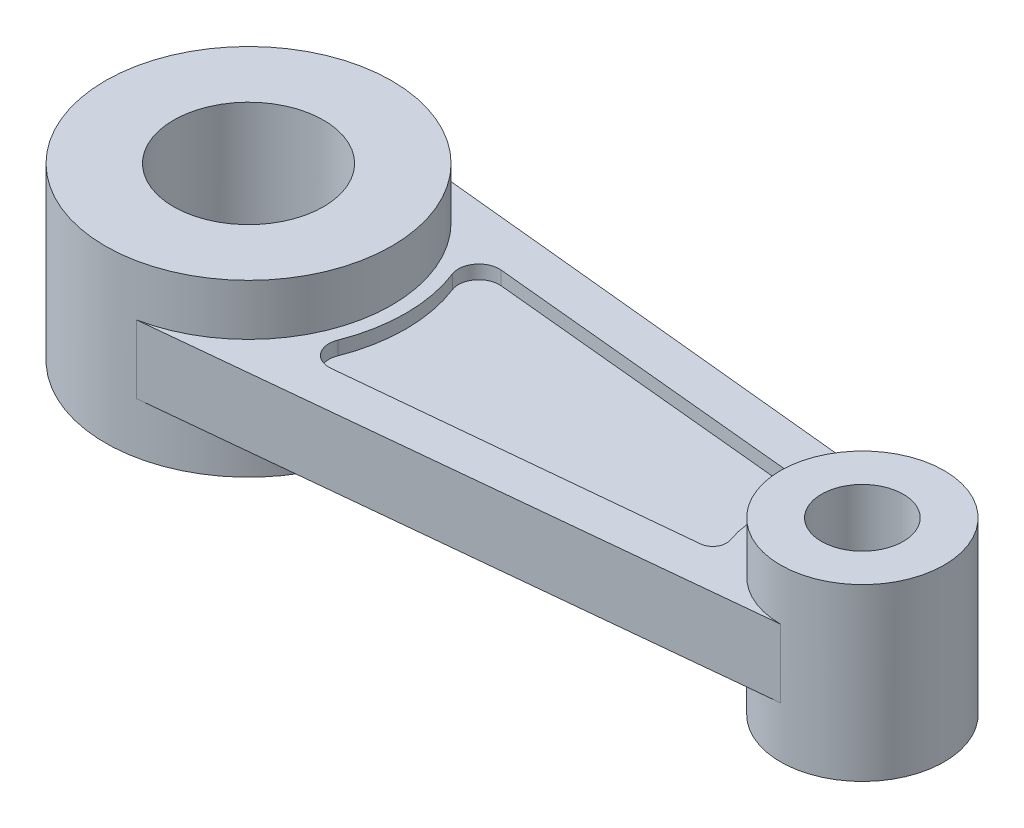
ISO-10303-21;
HEADER;
FILE_DESCRIPTION(('STEP AP214'),'2;1');
FILE_NAME('part.step','',(''),(''),'','','');
FILE_SCHEMA(('AUTOMOTIVE_DESIGN { 1 0 10303 214 1 1 1 1 }'));
ENDSEC;
DATA;
#1=APPLICATION_CONTEXT('core data for automotive mechanical design processes');
#2=APPLICATION_PROTOCOL_DEFINITION('international standard','automotive_design',2000,#1);
#3=PRODUCT_CONTEXT('',#1,'mechanical');
#4=PRODUCT('Part','Part','',(#3));
#5=PRODUCT_RELATED_PRODUCT_CATEGORY('part','',(#4));
#6=PRODUCT_DEFINITION_FORMATION('','',#4);
#7=PRODUCT_DEFINITION_CONTEXT('part definition',#1,'design');
#8=PRODUCT_DEFINITION('design','',#6,#7);
#9=PRODUCT_DEFINITION_SHAPE('','',#8);
#10=(LENGTH_UNIT() NAMED_UNIT(*) SI_UNIT(.MILLI.,.METRE.));
#11=(NAMED_UNIT(*) PLANE_ANGLE_UNIT() SI_UNIT($,.RADIAN.));
#12=(NAMED_UNIT(*) SI_UNIT($,.STERADIAN.) SOLID_ANGLE_UNIT());
#13=UNCERTAINTY_MEASURE_WITH_UNIT(LENGTH_MEASURE(1.E-05),#10,'distance_accuracy_value','');
#14=(GEOMETRIC_REPRESENTATION_CONTEXT(3) GLOBAL_UNCERTAINTY_ASSIGNED_CONTEXT((#13)) GLOBAL_UNIT_ASSIGNED_CONTEXT((#10,
#11,#12)) REPRESENTATION_CONTEXT('',''));
#15=CARTESIAN_POINT('',(0.,0.,0.));
#16=DIRECTION('',(0.,0.,1.));
#17=DIRECTION('',(1.,0.,0.));
#18=AXIS2_PLACEMENT_3D('',#15,#16,#17);
#19=CARTESIAN_POINT('',(0.,5.,0.));
#20=DIRECTION('',(0.,-1.,0.));
#21=DIRECTION('',(0.,0.,-1.));
#22=AXIS2_PLACEMENT_3D('',#19,#20,#21);
#23=PLANE('',#22);
#24=CARTESIAN_POINT('',(90.,5.,0.));
#25=DIRECTION('',(0.,-1.,0.));
#26=DIRECTION('',(0.,0.,-1.));
#27=AXIS2_PLACEMENT_3D('',#24,#25,#26);
#28=CIRCLE('',#27,12.);
#29=CARTESIAN_POINT('',(90.,5.,-12.));
#30=VERTEX_POINT('',#29);
#31=CARTESIAN_POINT('',(90.,5.,12.));
#32=VERTEX_POINT('',#31);
#33=EDGE_CURVE('E11',#30,#32,#28,.F.);
#34=ORIENTED_EDGE('',*,*,#33,.F.);
#35=DIRECTION('',(0.995037190209989,0.,0.0995037190209989));
#36=VECTOR('',#35,1.);
#37=CARTESIAN_POINT('',(0.,5.,-21.));
#38=LINE('',#37,#36);
#39=CARTESIAN_POINT('',(4.15841584158416,5.,-20.5841584158416));
#40=VERTEX_POINT('',#39);
#41=EDGE_CURVE('E397',#40,#30,#38,.T.);
#42=ORIENTED_EDGE('',*,*,#41,.F.);
#43=CARTESIAN_POINT('',(0.,5.,0.));
#44=DIRECTION('',(0.,-1.,0.));
#45=DIRECTION('',(0.,0.,-1.));
#46=AXIS2_PLACEMENT_3D('',#43,#44,#45);
#47=CIRCLE('',#46,21.);
#48=CARTESIAN_POINT('',(4.1584158415842,5.,20.5841584158416));
#49=VERTEX_POINT('',#48);
#50=EDGE_CURVE('E49',#49,#40,#47,.F.);
#51=ORIENTED_EDGE('',*,*,#50,.F.);
#52=DIRECTION('',(-0.995037190209989,0.,0.0995037190209989));
#53=VECTOR('',#52,1.);
#54=CARTESIAN_POINT('',(90.,5.,12.));
#55=LINE('',#54,#53);
#56=EDGE_CURVE('E393',#32,#49,#55,.T.);
#57=ORIENTED_EDGE('',*,*,#56,.F.);
#58=EDGE_LOOP('',(#34,#42,#51,#57));
#59=FACE_BOUND('',#58,.T.);
#60=CARTESIAN_POINT('',(24.2724452301592,5.,9.49146466859802));
#61=DIRECTION('',(0.,-1.,0.));
#62=DIRECTION('',(0.,0.,-1.));
#63=AXIS2_PLACEMENT_3D('',#60,#61,#62);
#64=CIRCLE('',#63,3.);
#65=CARTESIAN_POINT('',(24.5626925527096,5.,12.477391072874));
#66=VERTEX_POINT('',#65);
#67=CARTESIAN_POINT('',(21.4784650692004,5.,8.39891038611666));
#68=VERTEX_POINT('',#67);
#69=EDGE_CURVE('E65',#66,#68,#64,.T.);
#70=ORIENTED_EDGE('',*,*,#69,.T.);
#71=CARTESIAN_POINT('',(0.,5.,0.));
#72=DIRECTION('',(0.,1.,0.));
#73=DIRECTION('',(0.,0.,1.));
#74=AXIS2_PLACEMENT_3D('',#71,#72,#73);
#75=CIRCLE('',#74,23.0622236005741);
#76=CARTESIAN_POINT('',(21.4784650692004,5.,-8.39891038611666));
#77=VERTEX_POINT('',#76);
#78=EDGE_CURVE('E303',#68,#77,#75,.T.);
#79=ORIENTED_EDGE('',*,*,#78,.T.);
#80=CARTESIAN_POINT('',(24.2724452301592,5.,-9.49146466859802));
#81=DIRECTION('',(0.,-1.,0.));
#82=DIRECTION('',(0.,0.,-1.));
#83=AXIS2_PLACEMENT_3D('',#80,#81,#82);
#84=CIRCLE('',#83,3.);
#85=CARTESIAN_POINT('',(24.5626925527096,5.,-12.477391072874));
#86=VERTEX_POINT('',#85);
#87=EDGE_CURVE('E307',#77,#86,#84,.T.);
#88=ORIENTED_EDGE('',*,*,#87,.T.);
#89=DIRECTION('',(0.995308801425318,0.,0.0967491075167938));
#90=VECTOR('',#89,1.);
#91=CARTESIAN_POINT('',(24.5626925527096,5.,-12.477391072874));
#92=LINE('',#91,#90);
#93=CARTESIAN_POINT('',(73.9432407691823,5.,-7.67734915443405));
#94=VERTEX_POINT('',#93);
#95=EDGE_CURVE('E311',#86,#94,#92,.T.);
#96=ORIENTED_EDGE('',*,*,#95,.T.);
#97=CARTESIAN_POINT('',(73.7497425541487,5.,-5.68673155158341));
#98=DIRECTION('',(0.,1.,0.));
#99=DIRECTION('',(0.,0.,1.));
#100=AXIS2_PLACEMENT_3D('',#97,#98,#99);
#101=CIRCLE('',#100,2.);
#102=CARTESIAN_POINT('',(75.637490362848,5.,-5.02611955445448));
#103=VERTEX_POINT('',#102);
#104=EDGE_CURVE('E315',#103,#94,#101,.T.);
#105=ORIENTED_EDGE('',*,*,#104,.F.);
#106=CARTESIAN_POINT('',(90.,5.,0.));
#107=DIRECTION('',(0.,1.,0.));
#108=DIRECTION('',(0.,0.,1.));
#109=AXIS2_PLACEMENT_3D('',#106,#107,#108);
#110=CIRCLE('',#109,15.2165554858172);
#111=CARTESIAN_POINT('',(75.637490362848,5.,5.02611955445448));
#112=VERTEX_POINT('',#111);
#113=EDGE_CURVE('E319',#103,#112,#110,.T.);
#114=ORIENTED_EDGE('',*,*,#113,.T.);
#115=CARTESIAN_POINT('',(73.7497425541487,5.,5.68673155158342));
#116=DIRECTION('',(0.,1.,0.));
#117=DIRECTION('',(0.,0.,1.));
#118=AXIS2_PLACEMENT_3D('',#115,#116,#117);
#119=CIRCLE('',#118,2.);
#120=CARTESIAN_POINT('',(73.9432407691823,5.,7.67734915443405));
#121=VERTEX_POINT('',#120);
#122=EDGE_CURVE('E323',#121,#112,#119,.T.);
#123=ORIENTED_EDGE('',*,*,#122,.F.);
#124=DIRECTION('',(0.995308801425318,0.,-0.0967491075167937));
#125=VECTOR('',#124,1.);
#126=CARTESIAN_POINT('',(24.5626925527096,5.,12.477391072874));
#127=LINE('',#126,#125);
#128=EDGE_CURVE('E276',#66,#121,#127,.T.);
#129=ORIENTED_EDGE('',*,*,#128,.F.);
#130=EDGE_LOOP('',(#70,#79,#88,#96,#105,#114,#123,#129));
#131=FACE_BOUND('',#130,.T.);
#132=ADVANCED_FACE('F39',(#59,#131),#23,.F.);
#133=CARTESIAN_POINT('',(90.,5.,12.));
#134=DIRECTION('',(0.0995037190209989,0.,0.995037190209989));
#135=DIRECTION('',(0.995037190209989,0.,-0.0995037190209989));
#136=AXIS2_PLACEMENT_3D('',#133,#134,#135);
#137=PLANE('',#136);
#138=DIRECTION('',(0.,-1.,0.));
#139=VECTOR('',#138,1.);
#140=CARTESIAN_POINT('',(4.1584158415841,12.5,20.5841584158416));
#141=LINE('',#140,#139);
#142=CARTESIAN_POINT('',(4.1584158415841,-5.,20.5841584158416));
#143=VERTEX_POINT('',#142);
#144=EDGE_CURVE('E389',#49,#143,#141,.T.);
#145=ORIENTED_EDGE('',*,*,#144,.T.);
#146=DIRECTION('',(-0.995037190209989,0.,0.0995037190209989));
#147=VECTOR('',#146,1.);
#148=CARTESIAN_POINT('',(90.,-5.,12.));
#149=LINE('',#148,#147);
#150=CARTESIAN_POINT('',(90.,-5.,12.));
#151=VERTEX_POINT('',#150);
#152=EDGE_CURVE('E392',#151,#143,#149,.T.);
#153=ORIENTED_EDGE('',*,*,#152,.F.);
#154=DIRECTION('',(0.,-1.,0.));
#155=VECTOR('',#154,1.);
#156=CARTESIAN_POINT('',(90.,5.,12.));
#157=LINE('',#156,#155);
#158=EDGE_CURVE('E411',#32,#151,#157,.T.);
#159=ORIENTED_EDGE('',*,*,#158,.F.);
#160=ORIENTED_EDGE('',*,*,#56,.T.);
#161=EDGE_LOOP('',(#145,#153,#159,#160));
#162=FACE_BOUND('',#161,.T.);
#163=ADVANCED_FACE('F41',(#162),#137,.T.);
#164=CARTESIAN_POINT('',(0.,5.,-21.));
#165=DIRECTION('',(0.0995037190209989,0.,-0.995037190209989));
#166=DIRECTION('',(-0.995037190209989,0.,-0.0995037190209989));
#167=AXIS2_PLACEMENT_3D('',#164,#165,#166);
#168=PLANE('',#167);
#169=DIRECTION('',(0.995037190209989,0.,0.0995037190209989));
#170=VECTOR('',#169,1.);
#171=CARTESIAN_POINT('',(0.,-5.,-21.));
#172=LINE('',#171,#170);
#173=CARTESIAN_POINT('',(4.15841584158416,-5.,-20.5841584158416));
#174=VERTEX_POINT('',#173);
#175=CARTESIAN_POINT('',(90.,-5.,-12.));
#176=VERTEX_POINT('',#175);
#177=EDGE_CURVE('E398',#174,#176,#172,.T.);
#178=ORIENTED_EDGE('',*,*,#177,.F.);
#179=DIRECTION('',(0.,-1.,0.));
#180=VECTOR('',#179,1.);
#181=CARTESIAN_POINT('',(4.1584158415841,12.5,-20.5841584158416));
#182=LINE('',#181,#180);
#183=EDGE_CURVE('E386',#174,#40,#182,.F.);
#184=ORIENTED_EDGE('',*,*,#183,.T.);
#185=ORIENTED_EDGE('',*,*,#41,.T.);
#186=DIRECTION('',(0.,-1.,0.));
#187=VECTOR('',#186,1.);
#188=CARTESIAN_POINT('',(90.,5.,-12.));
#189=LINE('',#188,#187);
#190=EDGE_CURVE('E402',#30,#176,#189,.T.);
#191=ORIENTED_EDGE('',*,*,#190,.T.);
#192=EDGE_LOOP('',(#178,#184,#185,#191));
#193=FACE_BOUND('',#192,.T.);
#194=ADVANCED_FACE('F456',(#193),#168,.T.);
#195=CARTESIAN_POINT('',(0.,-5.,0.));
#196=DIRECTION('',(0.,-1.,0.));
#197=DIRECTION('',(0.,0.,-1.));
#198=AXIS2_PLACEMENT_3D('',#195,#196,#197);
#199=PLANE('',#198);
#200=CARTESIAN_POINT('',(75.4625246039867,-5.,6.12689569126327));
#201=DIRECTION('',(0.,-1.,0.));
#202=DIRECTION('',(0.,0.,-1.));
#203=AXIS2_PLACEMENT_3D('',#200,#201,#202);
#204=CIRCLE('',#203,2.);
#205=CARTESIAN_POINT('',(77.3055298459093,-5.,5.35015141014773));
#206=VERTEX_POINT('',#205);
#207=CARTESIAN_POINT('',(75.6538519051062,-5.,8.11772312322373));
#208=VERTEX_POINT('',#207);
#209=EDGE_CURVE('E57',#206,#208,#204,.T.);
#210=ORIENTED_EDGE('',*,*,#209,.F.);
#211=CARTESIAN_POINT('',(90.,-5.,0.));
#212=DIRECTION('',(0.,-1.,0.));
#213=DIRECTION('',(0.,0.,-1.));
#214=AXIS2_PLACEMENT_3D('',#211,#212,#213);
#215=CIRCLE('',#214,13.775837274177);
#216=CARTESIAN_POINT('',(77.3055298459093,-5.,-5.35015141014772));
#217=VERTEX_POINT('',#216);
#218=EDGE_CURVE('E203',#206,#217,#215,.T.);
#219=ORIENTED_EDGE('',*,*,#218,.T.);
#220=CARTESIAN_POINT('',(75.4625246039867,-5.,-6.12689569126327));
#221=DIRECTION('',(0.,-1.,0.));
#222=DIRECTION('',(0.,0.,-1.));
#223=AXIS2_PLACEMENT_3D('',#220,#221,#222);
#224=CIRCLE('',#223,2.);
#225=CARTESIAN_POINT('',(75.6538519051063,-5.,-8.11772312322374));
#226=VERTEX_POINT('',#225);
#227=EDGE_CURVE('E207',#226,#217,#224,.T.);
#228=ORIENTED_EDGE('',*,*,#227,.F.);
#229=DIRECTION('',(0.995413715980232,0.,0.0956636505597921));
#230=VECTOR('',#229,1.);
#231=CARTESIAN_POINT('',(25.3522196932445,-5.,-12.9519319443912));
#232=LINE('',#231,#230);
#233=CARTESIAN_POINT('',(25.3522196932445,-5.,-12.9519319443912));
#234=VERTEX_POINT('',#233);
#235=EDGE_CURVE('E244',#234,#226,#232,.T.);
#236=ORIENTED_EDGE('',*,*,#235,.F.);
#237=CARTESIAN_POINT('',(25.0652287415651,-5.,-9.96569079645051));
#238=DIRECTION('',(0.,1.,0.));
#239=DIRECTION('',(0.,0.,1.));
#240=AXIS2_PLACEMENT_3D('',#237,#238,#239);
#241=CIRCLE('',#240,3.);
#242=CARTESIAN_POINT('',(22.277488229895,-5.,-8.85731232336785));
#243=VERTEX_POINT('',#242);
#244=EDGE_CURVE('E240',#234,#243,#241,.T.);
#245=ORIENTED_EDGE('',*,*,#244,.T.);
#246=CARTESIAN_POINT('',(0.,-5.,0.));
#247=DIRECTION('',(0.,-1.,0.));
#248=DIRECTION('',(0.,0.,-1.));
#249=AXIS2_PLACEMENT_3D('',#246,#247,#248);
#250=CIRCLE('',#249,23.9737035817746);
#251=CARTESIAN_POINT('',(22.277488229895,-5.,8.85731232336785));
#252=VERTEX_POINT('',#251);
#253=EDGE_CURVE('E236',#243,#252,#250,.T.);
#254=ORIENTED_EDGE('',*,*,#253,.T.);
#255=CARTESIAN_POINT('',(25.0652287415651,-5.,9.96569079645051));
#256=DIRECTION('',(0.,1.,0.));
#257=DIRECTION('',(0.,0.,1.));
#258=AXIS2_PLACEMENT_3D('',#255,#256,#257);
#259=CIRCLE('',#258,3.);
#260=CARTESIAN_POINT('',(25.3522196932445,-5.,12.9519319443912));
#261=VERTEX_POINT('',#260);
#262=EDGE_CURVE('E232',#252,#261,#259,.T.);
#263=ORIENTED_EDGE('',*,*,#262,.T.);
#264=DIRECTION('',(-0.995413715980232,0.,0.0956636505597921));
#265=VECTOR('',#264,1.);
#266=CARTESIAN_POINT('',(75.6538519051063,-5.,8.11772312322374));
#267=LINE('',#266,#265);
#268=EDGE_CURVE('E229',#208,#261,#267,.T.);
#269=ORIENTED_EDGE('',*,*,#268,.F.);
#270=EDGE_LOOP('',(#210,#219,#228,#236,#245,#254,#263,#269));
#271=FACE_BOUND('',#270,.T.);
#272=ORIENTED_EDGE('',*,*,#177,.T.);
#273=CARTESIAN_POINT('',(90.,-5.,0.));
#274=DIRECTION('',(0.,-1.,0.));
#275=DIRECTION('',(0.,0.,-1.));
#276=AXIS2_PLACEMENT_3D('',#273,#274,#275);
#277=CIRCLE('',#276,12.);
#278=EDGE_CURVE('E366',#176,#151,#277,.F.);
#279=ORIENTED_EDGE('',*,*,#278,.T.);
#280=ORIENTED_EDGE('',*,*,#152,.T.);
#281=CARTESIAN_POINT('',(0.,-5.,0.));
#282=DIRECTION('',(0.,-1.,0.));
#283=DIRECTION('',(0.,0.,-1.));
#284=AXIS2_PLACEMENT_3D('',#281,#282,#283);
#285=CIRCLE('',#284,21.);
#286=EDGE_CURVE('E374',#143,#174,#285,.F.);
#287=ORIENTED_EDGE('',*,*,#286,.T.);
#288=EDGE_LOOP('',(#272,#279,#280,#287));
#289=FACE_BOUND('',#288,.T.);
#290=ADVANCED_FACE('F435',(#271,#289),#199,.T.);
#291=CARTESIAN_POINT('',(0.,12.5,0.));
#292=DIRECTION('',(0.,-1.,0.));
#293=DIRECTION('',(0.,0.,-1.));
#294=AXIS2_PLACEMENT_3D('',#291,#292,#293);
#295=CYLINDRICAL_SURFACE('',#294,21.);
#296=ORIENTED_EDGE('',*,*,#286,.F.);
#297=ORIENTED_EDGE('',*,*,#144,.F.);
#298=ORIENTED_EDGE('',*,*,#50,.T.);
#299=ORIENTED_EDGE('',*,*,#183,.F.);
#300=EDGE_LOOP('',(#296,#297,#298,#299));
#301=FACE_BOUND('',#300,.T.);
#302=CARTESIAN_POINT('',(0.,-12.5,0.));
#303=DIRECTION('',(0.,-1.,0.));
#304=DIRECTION('',(0.,0.,-1.));
#305=AXIS2_PLACEMENT_3D('',#302,#303,#304);
#306=CIRCLE('',#305,21.);
#307=CARTESIAN_POINT('',(0.,-12.5,-21.));
#308=VERTEX_POINT('',#307);
#309=EDGE_CURVE('E370',#308,#308,#306,.T.);
#310=ORIENTED_EDGE('',*,*,#309,.F.);
#311=EDGE_LOOP('',(#310));
#312=FACE_BOUND('',#311,.T.);
#313=CARTESIAN_POINT('',(0.,12.5,0.));
#314=DIRECTION('',(0.,1.,0.));
#315=DIRECTION('',(0.,0.,1.));
#316=AXIS2_PLACEMENT_3D('',#313,#314,#315);
#317=CIRCLE('',#316,21.);
#318=CARTESIAN_POINT('',(0.,12.5,21.));
#319=VERTEX_POINT('',#318);
#320=EDGE_CURVE('E382',#319,#319,#317,.T.);
#321=ORIENTED_EDGE('',*,*,#320,.F.);
#322=EDGE_LOOP('',(#321));
#323=FACE_BOUND('',#322,.T.);
#324=ADVANCED_FACE('F431',(#301,#312,#323),#295,.T.);
#325=CARTESIAN_POINT('',(0.,12.5,0.));
#326=DIRECTION('',(0.,1.,0.));
#327=DIRECTION('',(0.,0.,1.));
#328=AXIS2_PLACEMENT_3D('',#325,#326,#327);
#329=PLANE('',#328);
#330=CARTESIAN_POINT('',(0.,12.5,0.));
#331=DIRECTION('',(0.,1.,0.));
#332=DIRECTION('',(0.,0.,1.));
#333=AXIS2_PLACEMENT_3D('',#330,#331,#332);
#334=CIRCLE('',#333,11.);
#335=CARTESIAN_POINT('',(0.,12.5,11.));
#336=VERTEX_POINT('',#335);
#337=EDGE_CURVE('E357',#336,#336,#334,.T.);
#338=ORIENTED_EDGE('',*,*,#337,.F.);
#339=EDGE_LOOP('',(#338));
#340=FACE_BOUND('',#339,.T.);
#341=ORIENTED_EDGE('',*,*,#320,.T.);
#342=EDGE_LOOP('',(#341));
#343=FACE_BOUND('',#342,.T.);
#344=ADVANCED_FACE('F434',(#340,#343),#329,.T.);
#345=CARTESIAN_POINT('',(90.,12.5,0.));
#346=DIRECTION('',(0.,-1.,0.));
#347=DIRECTION('',(0.,0.,-1.));
#348=AXIS2_PLACEMENT_3D('',#345,#346,#347);
#349=CYLINDRICAL_SURFACE('',#348,12.);
#350=ORIENTED_EDGE('',*,*,#278,.F.);
#351=ORIENTED_EDGE('',*,*,#190,.F.);
#352=ORIENTED_EDGE('',*,*,#33,.T.);
#353=ORIENTED_EDGE('',*,*,#158,.T.);
#354=EDGE_LOOP('',(#350,#351,#352,#353));
#355=FACE_BOUND('',#354,.T.);
#356=CARTESIAN_POINT('',(90.,-12.5,0.));
#357=DIRECTION('',(0.,-1.,0.));
#358=DIRECTION('',(0.,0.,-1.));
#359=AXIS2_PLACEMENT_3D('',#356,#357,#358);
#360=CIRCLE('',#359,12.);
#361=CARTESIAN_POINT('',(90.,-12.5,-12.));
#362=VERTEX_POINT('',#361);
#363=EDGE_CURVE('E362',#362,#362,#360,.T.);
#364=ORIENTED_EDGE('',*,*,#363,.F.);
#365=EDGE_LOOP('',(#364));
#366=FACE_BOUND('',#365,.T.);
#367=CARTESIAN_POINT('',(90.,12.5,0.));
#368=DIRECTION('',(0.,1.,0.));
#369=DIRECTION('',(0.,0.,1.));
#370=AXIS2_PLACEMENT_3D('',#367,#368,#369);
#371=CIRCLE('',#370,12.);
#372=CARTESIAN_POINT('',(90.,12.5,12.));
#373=VERTEX_POINT('',#372);
#374=EDGE_CURVE('E378',#373,#373,#371,.T.);
#375=ORIENTED_EDGE('',*,*,#374,.F.);
#376=EDGE_LOOP('',(#375));
#377=FACE_BOUND('',#376,.T.);
#378=ADVANCED_FACE('F441',(#355,#366,#377),#349,.T.);
#379=CARTESIAN_POINT('',(90.,12.5,0.));
#380=DIRECTION('',(0.,1.,0.));
#381=DIRECTION('',(0.,0.,1.));
#382=AXIS2_PLACEMENT_3D('',#379,#380,#381);
#383=PLANE('',#382);
#384=CARTESIAN_POINT('',(90.,12.5,0.));
#385=DIRECTION('',(0.,1.,0.));
#386=DIRECTION('',(0.,0.,1.));
#387=AXIS2_PLACEMENT_3D('',#384,#385,#386);
#388=CIRCLE('',#387,6.);
#389=CARTESIAN_POINT('',(90.,12.5,6.));
#390=VERTEX_POINT('',#389);
#391=EDGE_CURVE('E353',#390,#390,#388,.T.);
#392=ORIENTED_EDGE('',*,*,#391,.F.);
#393=EDGE_LOOP('',(#392));
#394=FACE_BOUND('',#393,.T.);
#395=ORIENTED_EDGE('',*,*,#374,.T.);
#396=EDGE_LOOP('',(#395));
#397=FACE_BOUND('',#396,.T.);
#398=ADVANCED_FACE('F427',(#394,#397),#383,.T.);
#399=CARTESIAN_POINT('',(0.,-12.5,0.));
#400=DIRECTION('',(0.,-1.,0.));
#401=DIRECTION('',(0.,0.,-1.));
#402=AXIS2_PLACEMENT_3D('',#399,#400,#401);
#403=PLANE('',#402);
#404=CARTESIAN_POINT('',(0.,-12.5,0.));
#405=DIRECTION('',(0.,-1.,0.));
#406=DIRECTION('',(0.,0.,-1.));
#407=AXIS2_PLACEMENT_3D('',#404,#405,#406);
#408=CIRCLE('',#407,11.);
#409=CARTESIAN_POINT('',(0.,-12.5,-11.));
#410=VERTEX_POINT('',#409);
#411=EDGE_CURVE('E361',#410,#410,#408,.T.);
#412=ORIENTED_EDGE('',*,*,#411,.F.);
#413=EDGE_LOOP('',(#412));
#414=FACE_BOUND('',#413,.T.);
#415=ORIENTED_EDGE('',*,*,#309,.T.);
#416=EDGE_LOOP('',(#415));
#417=FACE_BOUND('',#416,.T.);
#418=ADVANCED_FACE('F423',(#414,#417),#403,.T.);
#419=CARTESIAN_POINT('',(90.,-12.5,0.));
#420=DIRECTION('',(0.,-1.,0.));
#421=DIRECTION('',(0.,0.,-1.));
#422=AXIS2_PLACEMENT_3D('',#419,#420,#421);
#423=PLANE('',#422);
#424=CARTESIAN_POINT('',(90.,-12.5,0.));
#425=DIRECTION('',(0.,-1.,0.));
#426=DIRECTION('',(0.,0.,-1.));
#427=AXIS2_PLACEMENT_3D('',#424,#425,#426);
#428=CIRCLE('',#427,6.);
#429=CARTESIAN_POINT('',(90.,-12.5,-6.));
#430=VERTEX_POINT('',#429);
#431=EDGE_CURVE('E43',#430,#430,#428,.T.);
#432=ORIENTED_EDGE('',*,*,#431,.F.);
#433=EDGE_LOOP('',(#432));
#434=FACE_BOUND('',#433,.T.);
#435=ORIENTED_EDGE('',*,*,#363,.T.);
#436=EDGE_LOOP('',(#435));
#437=FACE_BOUND('',#436,.T.);
#438=ADVANCED_FACE('F426',(#434,#437),#423,.T.);
#439=CARTESIAN_POINT('',(0.,-56.5,0.));
#440=DIRECTION('',(0.,1.,0.));
#441=DIRECTION('',(0.,0.,1.));
#442=AXIS2_PLACEMENT_3D('',#439,#440,#441);
#443=CYLINDRICAL_SURFACE('',#442,11.);
#444=ORIENTED_EDGE('',*,*,#411,.T.);
#445=EDGE_LOOP('',(#444));
#446=FACE_BOUND('',#445,.T.);
#447=ORIENTED_EDGE('',*,*,#337,.T.);
#448=EDGE_LOOP('',(#447));
#449=FACE_BOUND('',#448,.T.);
#450=ADVANCED_FACE('F420',(#446,#449),#443,.F.);
#451=CARTESIAN_POINT('',(90.,-56.5,0.));
#452=DIRECTION('',(0.,1.,0.));
#453=DIRECTION('',(0.,0.,1.));
#454=AXIS2_PLACEMENT_3D('',#451,#452,#453);
#455=CYLINDRICAL_SURFACE('',#454,6.);
#456=ORIENTED_EDGE('',*,*,#431,.T.);
#457=EDGE_LOOP('',(#456));
#458=FACE_BOUND('',#457,.T.);
#459=ORIENTED_EDGE('',*,*,#391,.T.);
#460=EDGE_LOOP('',(#459));
#461=FACE_BOUND('',#460,.T.);
#462=ADVANCED_FACE('F492',(#458,#461),#455,.F.);
#463=CARTESIAN_POINT('',(24.2724452301592,3.,9.49146466859802));
#464=DIRECTION('',(0.,1.,0.));
#465=DIRECTION('',(0.,0.,1.));
#466=AXIS2_PLACEMENT_3D('',#463,#464,#465);
#467=CYLINDRICAL_SURFACE('',#466,3.);
#468=ORIENTED_EDGE('',*,*,#69,.F.);
#469=DIRECTION('',(0.,1.,0.));
#470=VECTOR('',#469,1.);
#471=CARTESIAN_POINT('',(24.5626925527096,3.,12.477391072874));
#472=LINE('',#471,#470);
#473=CARTESIAN_POINT('',(24.5626925527096,3.,12.477391072874));
#474=VERTEX_POINT('',#473);
#475=EDGE_CURVE('E300',#474,#66,#472,.T.);
#476=ORIENTED_EDGE('',*,*,#475,.F.);
#477=CARTESIAN_POINT('',(24.2724452301592,3.,9.49146466859802));
#478=DIRECTION('',(0.,-1.,0.));
#479=DIRECTION('',(0.,0.,-1.));
#480=AXIS2_PLACEMENT_3D('',#477,#478,#479);
#481=CIRCLE('',#480,3.);
#482=CARTESIAN_POINT('',(21.4784650692004,3.,8.39891038611666));
#483=VERTEX_POINT('',#482);
#484=EDGE_CURVE('E271',#474,#483,#481,.T.);
#485=ORIENTED_EDGE('',*,*,#484,.T.);
#486=DIRECTION('',(0.,1.,0.));
#487=VECTOR('',#486,1.);
#488=CARTESIAN_POINT('',(21.4784650692004,3.,8.39891038611666));
#489=LINE('',#488,#487);
#490=EDGE_CURVE('E350',#483,#68,#489,.T.);
#491=ORIENTED_EDGE('',*,*,#490,.T.);
#492=EDGE_LOOP('',(#468,#476,#485,#491));
#493=FACE_BOUND('',#492,.T.);
#494=ADVANCED_FACE('F495',(#493),#467,.F.);
#495=CARTESIAN_POINT('',(0.,3.,0.));
#496=DIRECTION('',(0.,1.,0.));
#497=DIRECTION('',(0.,0.,1.));
#498=AXIS2_PLACEMENT_3D('',#495,#496,#497);
#499=CYLINDRICAL_SURFACE('',#498,23.0622236005741);
#500=ORIENTED_EDGE('',*,*,#78,.F.);
#501=ORIENTED_EDGE('',*,*,#490,.F.);
#502=CARTESIAN_POINT('',(0.,3.,0.));
#503=DIRECTION('',(0.,1.,0.));
#504=DIRECTION('',(0.,0.,1.));
#505=AXIS2_PLACEMENT_3D('',#502,#503,#504);
#506=CIRCLE('',#505,23.0622236005741);
#507=CARTESIAN_POINT('',(21.4784650692004,3.,-8.39891038611666));
#508=VERTEX_POINT('',#507);
#509=EDGE_CURVE('E275',#483,#508,#506,.T.);
#510=ORIENTED_EDGE('',*,*,#509,.T.);
#511=DIRECTION('',(0.,1.,0.));
#512=VECTOR('',#511,1.);
#513=CARTESIAN_POINT('',(21.4784650692004,3.,-8.39891038611666));
#514=LINE('',#513,#512);
#515=EDGE_CURVE('E347',#508,#77,#514,.T.);
#516=ORIENTED_EDGE('',*,*,#515,.T.);
#517=EDGE_LOOP('',(#500,#501,#510,#516));
#518=FACE_BOUND('',#517,.T.);
#519=ADVANCED_FACE('F499',(#518),#499,.T.);
#520=CARTESIAN_POINT('',(24.2724452301592,3.,-9.49146466859802));
#521=DIRECTION('',(0.,1.,0.));
#522=DIRECTION('',(0.,0.,1.));
#523=AXIS2_PLACEMENT_3D('',#520,#521,#522);
#524=CYLINDRICAL_SURFACE('',#523,3.);
#525=ORIENTED_EDGE('',*,*,#87,.F.);
#526=ORIENTED_EDGE('',*,*,#515,.F.);
#527=CARTESIAN_POINT('',(24.2724452301592,3.,-9.49146466859802));
#528=DIRECTION('',(0.,-1.,0.));
#529=DIRECTION('',(0.,0.,-1.));
#530=AXIS2_PLACEMENT_3D('',#527,#528,#529);
#531=CIRCLE('',#530,3.);
#532=CARTESIAN_POINT('',(24.5626925527096,3.,-12.477391072874));
#533=VERTEX_POINT('',#532);
#534=EDGE_CURVE('E279',#508,#533,#531,.T.);
#535=ORIENTED_EDGE('',*,*,#534,.T.);
#536=DIRECTION('',(0.,1.,0.));
#537=VECTOR('',#536,1.);
#538=CARTESIAN_POINT('',(24.5626925527096,3.,-12.477391072874));
#539=LINE('',#538,#537);
#540=EDGE_CURVE('E344',#533,#86,#539,.T.);
#541=ORIENTED_EDGE('',*,*,#540,.T.);
#542=EDGE_LOOP('',(#525,#526,#535,#541));
#543=FACE_BOUND('',#542,.T.);
#544=ADVANCED_FACE('F502',(#543),#524,.F.);
#545=CARTESIAN_POINT('',(24.5626925527096,3.,-12.477391072874));
#546=DIRECTION('',(-0.0967491075167938,0.,0.995308801425318));
#547=DIRECTION('',(0.995308801425319,0.,0.0967491075167938));
#548=AXIS2_PLACEMENT_3D('',#545,#546,#547);
#549=PLANE('',#548);
#550=ORIENTED_EDGE('',*,*,#95,.F.);
#551=ORIENTED_EDGE('',*,*,#540,.F.);
#552=DIRECTION('',(0.995308801425318,0.,0.0967491075167938));
#553=VECTOR('',#552,1.);
#554=CARTESIAN_POINT('',(24.5626925527096,3.,-12.477391072874));
#555=LINE('',#554,#553);
#556=CARTESIAN_POINT('',(73.9432407691823,3.,-7.67734915443405));
#557=VERTEX_POINT('',#556);
#558=EDGE_CURVE('E282',#533,#557,#555,.T.);
#559=ORIENTED_EDGE('',*,*,#558,.T.);
#560=DIRECTION('',(0.,1.,0.));
#561=VECTOR('',#560,1.);
#562=CARTESIAN_POINT('',(73.9432407691823,3.,-7.67734915443405));
#563=LINE('',#562,#561);
#564=EDGE_CURVE('E341',#557,#94,#563,.T.);
#565=ORIENTED_EDGE('',*,*,#564,.T.);
#566=EDGE_LOOP('',(#550,#551,#559,#565));
#567=FACE_BOUND('',#566,.T.);
#568=ADVANCED_FACE('F506',(#567),#549,.T.);
#569=CARTESIAN_POINT('',(73.7497425541487,3.,-5.68673155158341));
#570=DIRECTION('',(0.,1.,0.));
#571=DIRECTION('',(0.,0.,1.));
#572=AXIS2_PLACEMENT_3D('',#569,#570,#571);
#573=CYLINDRICAL_SURFACE('',#572,2.);
#574=ORIENTED_EDGE('',*,*,#104,.T.);
#575=ORIENTED_EDGE('',*,*,#564,.F.);
#576=CARTESIAN_POINT('',(73.7497425541487,3.,-5.68673155158341));
#577=DIRECTION('',(0.,1.,0.));
#578=DIRECTION('',(0.,0.,1.));
#579=AXIS2_PLACEMENT_3D('',#576,#577,#578);
#580=CIRCLE('',#579,2.);
#581=CARTESIAN_POINT('',(75.637490362848,3.,-5.02611955445448));
#582=VERTEX_POINT('',#581);
#583=EDGE_CURVE('E285',#582,#557,#580,.T.);
#584=ORIENTED_EDGE('',*,*,#583,.F.);
#585=DIRECTION('',(0.,1.,0.));
#586=VECTOR('',#585,1.);
#587=CARTESIAN_POINT('',(75.637490362848,3.,-5.02611955445448));
#588=LINE('',#587,#586);
#589=EDGE_CURVE('E338',#582,#103,#588,.T.);
#590=ORIENTED_EDGE('',*,*,#589,.T.);
#591=EDGE_LOOP('',(#574,#575,#584,#590));
#592=FACE_BOUND('',#591,.T.);
#593=ADVANCED_FACE('F510',(#592),#573,.F.);
#594=CARTESIAN_POINT('',(90.,3.,0.));
#595=DIRECTION('',(0.,1.,0.));
#596=DIRECTION('',(0.,0.,1.));
#597=AXIS2_PLACEMENT_3D('',#594,#595,#596);
#598=CYLINDRICAL_SURFACE('',#597,15.2165554858172);
#599=ORIENTED_EDGE('',*,*,#113,.F.);
#600=ORIENTED_EDGE('',*,*,#589,.F.);
#601=CARTESIAN_POINT('',(90.,3.,0.));
#602=DIRECTION('',(0.,1.,0.));
#603=DIRECTION('',(0.,0.,1.));
#604=AXIS2_PLACEMENT_3D('',#601,#602,#603);
#605=CIRCLE('',#604,15.2165554858172);
#606=CARTESIAN_POINT('',(75.637490362848,3.,5.02611955445448));
#607=VERTEX_POINT('',#606);
#608=EDGE_CURVE('E289',#582,#607,#605,.T.);
#609=ORIENTED_EDGE('',*,*,#608,.T.);
#610=DIRECTION('',(0.,1.,0.));
#611=VECTOR('',#610,1.);
#612=CARTESIAN_POINT('',(75.637490362848,3.,5.02611955445448));
#613=LINE('',#612,#611);
#614=EDGE_CURVE('E335',#607,#112,#613,.T.);
#615=ORIENTED_EDGE('',*,*,#614,.T.);
#616=EDGE_LOOP('',(#599,#600,#609,#615));
#617=FACE_BOUND('',#616,.T.);
#618=ADVANCED_FACE('F514',(#617),#598,.T.);
#619=CARTESIAN_POINT('',(73.7497425541487,3.,5.68673155158342));
#620=DIRECTION('',(0.,1.,0.));
#621=DIRECTION('',(0.,0.,1.));
#622=AXIS2_PLACEMENT_3D('',#619,#620,#621);
#623=CYLINDRICAL_SURFACE('',#622,2.);
#624=ORIENTED_EDGE('',*,*,#122,.T.);
#625=ORIENTED_EDGE('',*,*,#614,.F.);
#626=CARTESIAN_POINT('',(73.7497425541487,3.,5.68673155158342));
#627=DIRECTION('',(0.,1.,0.));
#628=DIRECTION('',(0.,0.,1.));
#629=AXIS2_PLACEMENT_3D('',#626,#627,#628);
#630=CIRCLE('',#629,2.);
#631=CARTESIAN_POINT('',(73.9432407691823,3.,7.67734915443405));
#632=VERTEX_POINT('',#631);
#633=EDGE_CURVE('E292',#632,#607,#630,.T.);
#634=ORIENTED_EDGE('',*,*,#633,.F.);
#635=DIRECTION('',(0.,1.,0.));
#636=VECTOR('',#635,1.);
#637=CARTESIAN_POINT('',(73.9432407691823,3.,7.67734915443405));
#638=LINE('',#637,#636);
#639=EDGE_CURVE('E332',#632,#121,#638,.T.);
#640=ORIENTED_EDGE('',*,*,#639,.T.);
#641=EDGE_LOOP('',(#624,#625,#634,#640));
#642=FACE_BOUND('',#641,.T.);
#643=ADVANCED_FACE('F518',(#642),#623,.F.);
#644=CARTESIAN_POINT('',(24.5626925527096,3.,12.477391072874));
#645=DIRECTION('',(0.0967491075167937,0.,0.995308801425318));
#646=DIRECTION('',(0.995308801425319,0.,-0.0967491075167937));
#647=AXIS2_PLACEMENT_3D('',#644,#645,#646);
#648=PLANE('',#647);
#649=ORIENTED_EDGE('',*,*,#128,.T.);
#650=ORIENTED_EDGE('',*,*,#639,.F.);
#651=DIRECTION('',(0.995308801425318,0.,-0.0967491075167937));
#652=VECTOR('',#651,1.);
#653=CARTESIAN_POINT('',(24.5626925527096,3.,12.477391072874));
#654=LINE('',#653,#652);
#655=EDGE_CURVE('E296',#474,#632,#654,.T.);
#656=ORIENTED_EDGE('',*,*,#655,.F.);
#657=ORIENTED_EDGE('',*,*,#475,.T.);
#658=EDGE_LOOP('',(#649,#650,#656,#657));
#659=FACE_BOUND('',#658,.T.);
#660=ADVANCED_FACE('F522',(#659),#648,.F.);
#661=CARTESIAN_POINT('',(24.2724452301592,3.,9.49146466859802));
#662=DIRECTION('',(0.,-1.,0.));
#663=DIRECTION('',(0.,0.,-1.));
#664=AXIS2_PLACEMENT_3D('',#661,#662,#663);
#665=PLANE('',#664);
#666=ORIENTED_EDGE('',*,*,#484,.F.);
#667=ORIENTED_EDGE('',*,*,#655,.T.);
#668=ORIENTED_EDGE('',*,*,#633,.T.);
#669=ORIENTED_EDGE('',*,*,#608,.F.);
#670=ORIENTED_EDGE('',*,*,#583,.T.);
#671=ORIENTED_EDGE('',*,*,#558,.F.);
#672=ORIENTED_EDGE('',*,*,#534,.F.);
#673=ORIENTED_EDGE('',*,*,#509,.F.);
#674=EDGE_LOOP('',(#666,#667,#668,#669,#670,#671,#672,#673));
#675=FACE_BOUND('',#674,.T.);
#676=ADVANCED_FACE('F526',(#675),#665,.F.);
#677=CARTESIAN_POINT('',(75.4625246039867,-3.,6.12689569126327));
#678=DIRECTION('',(0.,-1.,0.));
#679=DIRECTION('',(0.,0.,-1.));
#680=AXIS2_PLACEMENT_3D('',#677,#678,#679);
#681=CYLINDRICAL_SURFACE('',#680,2.);
#682=ORIENTED_EDGE('',*,*,#209,.T.);
#683=DIRECTION('',(0.,-1.,0.));
#684=VECTOR('',#683,1.);
#685=CARTESIAN_POINT('',(75.6538519051063,-3.,8.11772312322374));
#686=LINE('',#685,#684);
#687=CARTESIAN_POINT('',(75.6538519051063,-3.,8.11772312322374));
#688=VERTEX_POINT('',#687);
#689=EDGE_CURVE('E178',#688,#208,#686,.T.);
#690=ORIENTED_EDGE('',*,*,#689,.F.);
#691=CARTESIAN_POINT('',(75.4625246039867,-3.,6.12689569126327));
#692=DIRECTION('',(0.,-1.,0.));
#693=DIRECTION('',(0.,0.,-1.));
#694=AXIS2_PLACEMENT_3D('',#691,#692,#693);
#695=CIRCLE('',#694,2.);
#696=CARTESIAN_POINT('',(77.3055298459093,-3.,5.35015141014773));
#697=VERTEX_POINT('',#696);
#698=EDGE_CURVE('E182',#697,#688,#695,.T.);
#699=ORIENTED_EDGE('',*,*,#698,.F.);
#700=DIRECTION('',(0.,-1.,0.));
#701=VECTOR('',#700,1.);
#702=CARTESIAN_POINT('',(77.3055298459093,-3.,5.35015141014773));
#703=LINE('',#702,#701);
#704=EDGE_CURVE('E251',#697,#206,#703,.T.);
#705=ORIENTED_EDGE('',*,*,#704,.T.);
#706=EDGE_LOOP('',(#682,#690,#699,#705));
#707=FACE_BOUND('',#706,.T.);
#708=ADVANCED_FACE('F180',(#707),#681,.F.);
#709=CARTESIAN_POINT('',(90.,-3.,0.));
#710=DIRECTION('',(0.,-1.,0.));
#711=DIRECTION('',(0.,0.,-1.));
#712=AXIS2_PLACEMENT_3D('',#709,#710,#711);
#713=CYLINDRICAL_SURFACE('',#712,13.775837274177);
#714=ORIENTED_EDGE('',*,*,#218,.F.);
#715=ORIENTED_EDGE('',*,*,#704,.F.);
#716=CARTESIAN_POINT('',(90.,-3.,0.));
#717=DIRECTION('',(0.,-1.,0.));
#718=DIRECTION('',(0.,0.,-1.));
#719=AXIS2_PLACEMENT_3D('',#716,#717,#718);
#720=CIRCLE('',#719,13.775837274177);
#721=CARTESIAN_POINT('',(77.3055298459093,-3.,-5.35015141014772));
#722=VERTEX_POINT('',#721);
#723=EDGE_CURVE('E188',#697,#722,#720,.T.);
#724=ORIENTED_EDGE('',*,*,#723,.T.);
#725=DIRECTION('',(0.,-1.,0.));
#726=VECTOR('',#725,1.);
#727=CARTESIAN_POINT('',(77.3055298459093,-3.,-5.35015141014772));
#728=LINE('',#727,#726);
#729=EDGE_CURVE('E254',#722,#217,#728,.T.);
#730=ORIENTED_EDGE('',*,*,#729,.T.);
#731=EDGE_LOOP('',(#714,#715,#724,#730));
#732=FACE_BOUND('',#731,.T.);
#733=ADVANCED_FACE('F533',(#732),#713,.T.);
#734=CARTESIAN_POINT('',(75.4625246039867,-3.,-6.12689569126327));
#735=DIRECTION('',(0.,-1.,0.));
#736=DIRECTION('',(0.,0.,-1.));
#737=AXIS2_PLACEMENT_3D('',#734,#735,#736);
#738=CYLINDRICAL_SURFACE('',#737,2.);
#739=ORIENTED_EDGE('',*,*,#227,.T.);
#740=ORIENTED_EDGE('',*,*,#729,.F.);
#741=CARTESIAN_POINT('',(75.4625246039867,-3.,-6.12689569126327));
#742=DIRECTION('',(0.,-1.,0.));
#743=DIRECTION('',(0.,0.,-1.));
#744=AXIS2_PLACEMENT_3D('',#741,#742,#743);
#745=CIRCLE('',#744,2.);
#746=CARTESIAN_POINT('',(75.6538519051063,-3.,-8.11772312322374));
#747=VERTEX_POINT('',#746);
#748=EDGE_CURVE('E222',#747,#722,#745,.T.);
#749=ORIENTED_EDGE('',*,*,#748,.F.);
#750=DIRECTION('',(0.,-1.,0.));
#751=VECTOR('',#750,1.);
#752=CARTESIAN_POINT('',(75.6538519051063,-3.,-8.11772312322374));
#753=LINE('',#752,#751);
#754=EDGE_CURVE('E257',#747,#226,#753,.T.);
#755=ORIENTED_EDGE('',*,*,#754,.T.);
#756=EDGE_LOOP('',(#739,#740,#749,#755));
#757=FACE_BOUND('',#756,.T.);
#758=ADVANCED_FACE('F551',(#757),#738,.F.);
#759=CARTESIAN_POINT('',(25.3522196932445,-3.,-12.9519319443912));
#760=DIRECTION('',(0.0956636505597921,0.,-0.995413715980232));
#761=DIRECTION('',(-0.995413715980232,0.,-0.0956636505597921));
#762=AXIS2_PLACEMENT_3D('',#759,#760,#761);
#763=PLANE('',#762);
#764=ORIENTED_EDGE('',*,*,#235,.T.);
#765=ORIENTED_EDGE('',*,*,#754,.F.);
#766=DIRECTION('',(0.995413715980232,0.,0.0956636505597921));
#767=VECTOR('',#766,1.);
#768=CARTESIAN_POINT('',(25.3522196932445,-3.,-12.9519319443912));
#769=LINE('',#768,#767);
#770=CARTESIAN_POINT('',(25.3522196932445,-3.,-12.9519319443912));
#771=VERTEX_POINT('',#770);
#772=EDGE_CURVE('E218',#771,#747,#769,.T.);
#773=ORIENTED_EDGE('',*,*,#772,.F.);
#774=DIRECTION('',(0.,-1.,0.));
#775=VECTOR('',#774,1.);
#776=CARTESIAN_POINT('',(25.3522196932445,-3.,-12.9519319443912));
#777=LINE('',#776,#775);
#778=EDGE_CURVE('E260',#771,#234,#777,.T.);
#779=ORIENTED_EDGE('',*,*,#778,.T.);
#780=EDGE_LOOP('',(#764,#765,#773,#779));
#781=FACE_BOUND('',#780,.T.);
#782=ADVANCED_FACE('F547',(#781),#763,.F.);
#783=CARTESIAN_POINT('',(25.0652287415651,-3.,-9.96569079645051));
#784=DIRECTION('',(0.,-1.,0.));
#785=DIRECTION('',(0.,0.,-1.));
#786=AXIS2_PLACEMENT_3D('',#783,#784,#785);
#787=CYLINDRICAL_SURFACE('',#786,3.);
#788=ORIENTED_EDGE('',*,*,#244,.F.);
#789=ORIENTED_EDGE('',*,*,#778,.F.);
#790=CARTESIAN_POINT('',(25.0652287415651,-3.,-9.96569079645051));
#791=DIRECTION('',(0.,1.,0.));
#792=DIRECTION('',(0.,0.,1.));
#793=AXIS2_PLACEMENT_3D('',#790,#791,#792);
#794=CIRCLE('',#793,3.);
#795=CARTESIAN_POINT('',(22.277488229895,-3.,-8.85731232336785));
#796=VERTEX_POINT('',#795);
#797=EDGE_CURVE('E215',#771,#796,#794,.T.);
#798=ORIENTED_EDGE('',*,*,#797,.T.);
#799=DIRECTION('',(0.,-1.,0.));
#800=VECTOR('',#799,1.);
#801=CARTESIAN_POINT('',(22.277488229895,-3.,-8.85731232336785));
#802=LINE('',#801,#800);
#803=EDGE_CURVE('E263',#796,#243,#802,.T.);
#804=ORIENTED_EDGE('',*,*,#803,.T.);
#805=EDGE_LOOP('',(#788,#789,#798,#804));
#806=FACE_BOUND('',#805,.T.);
#807=ADVANCED_FACE('F543',(#806),#787,.F.);
#808=CARTESIAN_POINT('',(0.,-3.,0.));
#809=DIRECTION('',(0.,-1.,0.));
#810=DIRECTION('',(0.,0.,-1.));
#811=AXIS2_PLACEMENT_3D('',#808,#809,#810);
#812=CYLINDRICAL_SURFACE('',#811,23.9737035817746);
#813=ORIENTED_EDGE('',*,*,#253,.F.);
#814=ORIENTED_EDGE('',*,*,#803,.F.);
#815=CARTESIAN_POINT('',(0.,-3.,0.));
#816=DIRECTION('',(0.,-1.,0.));
#817=DIRECTION('',(0.,0.,-1.));
#818=AXIS2_PLACEMENT_3D('',#815,#816,#817);
#819=CIRCLE('',#818,23.9737035817746);
#820=CARTESIAN_POINT('',(22.277488229895,-3.,8.85731232336785));
#821=VERTEX_POINT('',#820);
#822=EDGE_CURVE('E212',#796,#821,#819,.T.);
#823=ORIENTED_EDGE('',*,*,#822,.T.);
#824=DIRECTION('',(0.,-1.,0.));
#825=VECTOR('',#824,1.);
#826=CARTESIAN_POINT('',(22.277488229895,-3.,8.85731232336785));
#827=LINE('',#826,#825);
#828=EDGE_CURVE('E266',#821,#252,#827,.T.);
#829=ORIENTED_EDGE('',*,*,#828,.T.);
#830=EDGE_LOOP('',(#813,#814,#823,#829));
#831=FACE_BOUND('',#830,.T.);
#832=ADVANCED_FACE('F539',(#831),#812,.T.);
#833=CARTESIAN_POINT('',(25.0652287415651,-3.,9.96569079645051));
#834=DIRECTION('',(0.,-1.,0.));
#835=DIRECTION('',(0.,0.,-1.));
#836=AXIS2_PLACEMENT_3D('',#833,#834,#835);
#837=CYLINDRICAL_SURFACE('',#836,3.);
#838=ORIENTED_EDGE('',*,*,#262,.F.);
#839=ORIENTED_EDGE('',*,*,#828,.F.);
#840=CARTESIAN_POINT('',(25.0652287415651,-3.,9.96569079645051));
#841=DIRECTION('',(0.,1.,0.));
#842=DIRECTION('',(0.,0.,1.));
#843=AXIS2_PLACEMENT_3D('',#840,#841,#842);
#844=CIRCLE('',#843,3.);
#845=CARTESIAN_POINT('',(25.3522196932445,-3.,12.9519319443912));
#846=VERTEX_POINT('',#845);
#847=EDGE_CURVE('E197',#821,#846,#844,.T.);
#848=ORIENTED_EDGE('',*,*,#847,.T.);
#849=DIRECTION('',(0.,-1.,0.));
#850=VECTOR('',#849,1.);
#851=CARTESIAN_POINT('',(25.3522196932445,-3.,12.9519319443912));
#852=LINE('',#851,#850);
#853=EDGE_CURVE('E187',#846,#261,#852,.T.);
#854=ORIENTED_EDGE('',*,*,#853,.T.);
#855=EDGE_LOOP('',(#838,#839,#848,#854));
#856=FACE_BOUND('',#855,.T.);
#857=ADVANCED_FACE('F536',(#856),#837,.F.);
#858=CARTESIAN_POINT('',(75.6538519051063,-3.,8.11772312322374));
#859=DIRECTION('',(0.0956636505597921,0.,0.995413715980232));
#860=DIRECTION('',(0.995413715980232,0.,-0.0956636505597921));
#861=AXIS2_PLACEMENT_3D('',#858,#859,#860);
#862=PLANE('',#861);
#863=ORIENTED_EDGE('',*,*,#268,.T.);
#864=ORIENTED_EDGE('',*,*,#853,.F.);
#865=DIRECTION('',(-0.995413715980232,0.,0.0956636505597921));
#866=VECTOR('',#865,1.);
#867=CARTESIAN_POINT('',(75.6538519051063,-3.,8.11772312322374));
#868=LINE('',#867,#866);
#869=EDGE_CURVE('E192',#688,#846,#868,.T.);
#870=ORIENTED_EDGE('',*,*,#869,.F.);
#871=ORIENTED_EDGE('',*,*,#689,.T.);
#872=EDGE_LOOP('',(#863,#864,#870,#871));
#873=FACE_BOUND('',#872,.T.);
#874=ADVANCED_FACE('F193',(#873),#862,.F.);
#875=CARTESIAN_POINT('',(75.4625246039867,-3.,6.12689569126327));
#876=DIRECTION('',(0.,-1.,0.));
#877=DIRECTION('',(0.,0.,-1.));
#878=AXIS2_PLACEMENT_3D('',#875,#876,#877);
#879=PLANE('',#878);
#880=ORIENTED_EDGE('',*,*,#698,.T.);
#881=ORIENTED_EDGE('',*,*,#869,.T.);
#882=ORIENTED_EDGE('',*,*,#847,.F.);
#883=ORIENTED_EDGE('',*,*,#822,.F.);
#884=ORIENTED_EDGE('',*,*,#797,.F.);
#885=ORIENTED_EDGE('',*,*,#772,.T.);
#886=ORIENTED_EDGE('',*,*,#748,.T.);
#887=ORIENTED_EDGE('',*,*,#723,.F.);
#888=EDGE_LOOP('',(#880,#881,#882,#883,#884,#885,#886,#887));
#889=FACE_BOUND('',#888,.T.);
#890=ADVANCED_FACE('F200',(#889),#879,.T.);
#891=CLOSED_SHELL('',(#132,#163,#194,#290,#324,#344,#378,#398,#418,#438,#450,#462,#494,#519,
#544,#568,#593,#618,#643,#660,#676,#708,#733,#758,#782,#807,#832,#857,#874,#890));
#892=MANIFOLD_SOLID_BREP('B2',#891);
#893=ADVANCED_BREP_SHAPE_REPRESENTATION('',(#18,#892),#14);
#894=SHAPE_DEFINITION_REPRESENTATION(#9,#893);
ENDSEC;
END-ISO-10303-21;
